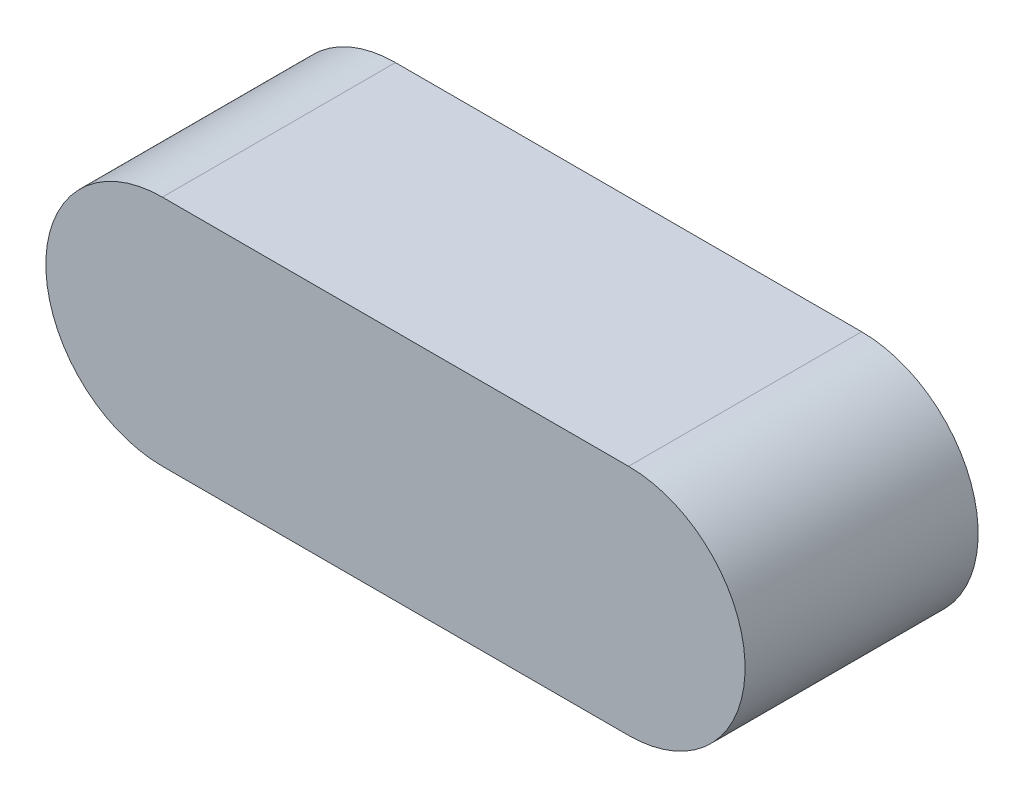
ISO-10303-21;
HEADER;
FILE_DESCRIPTION(('STEP AP214'),'2;1');
FILE_NAME('part.step','',(''),(''),'','','');
FILE_SCHEMA(('AUTOMOTIVE_DESIGN { 1 0 10303 214 1 1 1 1 }'));
ENDSEC;
DATA;
#1=APPLICATION_CONTEXT('core data for automotive mechanical design processes');
#2=APPLICATION_PROTOCOL_DEFINITION('international standard','automotive_design',2000,#1);
#3=PRODUCT_CONTEXT('',#1,'mechanical');
#4=PRODUCT('Part','Part','',(#3));
#5=PRODUCT_RELATED_PRODUCT_CATEGORY('part','',(#4));
#6=PRODUCT_DEFINITION_FORMATION('','',#4);
#7=PRODUCT_DEFINITION_CONTEXT('part definition',#1,'design');
#8=PRODUCT_DEFINITION('design','',#6,#7);
#9=PRODUCT_DEFINITION_SHAPE('','',#8);
#10=(LENGTH_UNIT() NAMED_UNIT(*) SI_UNIT(.MILLI.,.METRE.));
#11=(NAMED_UNIT(*) PLANE_ANGLE_UNIT() SI_UNIT($,.RADIAN.));
#12=(NAMED_UNIT(*) SI_UNIT($,.STERADIAN.) SOLID_ANGLE_UNIT());
#13=UNCERTAINTY_MEASURE_WITH_UNIT(LENGTH_MEASURE(1.E-05),#10,'distance_accuracy_value','');
#14=(GEOMETRIC_REPRESENTATION_CONTEXT(3) GLOBAL_UNCERTAINTY_ASSIGNED_CONTEXT((#13)) GLOBAL_UNIT_ASSIGNED_CONTEXT((#10,
#11,#12)) REPRESENTATION_CONTEXT('',''));
#15=CARTESIAN_POINT('',(0.,0.,0.));
#16=DIRECTION('',(0.,0.,1.));
#17=DIRECTION('',(1.,0.,0.));
#18=AXIS2_PLACEMENT_3D('',#15,#16,#17);
#19=CARTESIAN_POINT('',(5.,-10.,5.));
#20=DIRECTION('',(0.,0.,-1.));
#21=DIRECTION('',(-1.,0.,0.));
#22=AXIS2_PLACEMENT_3D('',#19,#20,#21);
#23=CYLINDRICAL_SURFACE('',#22,5.);
#24=CARTESIAN_POINT('',(5.,-10.,-5.));
#25=DIRECTION('',(0.,0.,1.));
#26=DIRECTION('',(1.,0.,0.));
#27=AXIS2_PLACEMENT_3D('',#24,#25,#26);
#28=CIRCLE('',#27,5.);
#29=CARTESIAN_POINT('',(5.,-4.99999999999999,-5.));
#30=VERTEX_POINT('',#29);
#31=CARTESIAN_POINT('',(5.,-15.,-5.));
#32=VERTEX_POINT('',#31);
#33=EDGE_CURVE('E104',#30,#32,#28,.T.);
#34=ORIENTED_EDGE('',*,*,#33,.T.);
#35=DIRECTION('',(0.,0.,-1.));
#36=VECTOR('',#35,1.);
#37=CARTESIAN_POINT('',(5.,-15.,5.));
#38=LINE('',#37,#36);
#39=CARTESIAN_POINT('',(5.,-15.,5.));
#40=VERTEX_POINT('',#39);
#41=EDGE_CURVE('E11',#40,#32,#38,.T.);
#42=ORIENTED_EDGE('',*,*,#41,.F.);
#43=CARTESIAN_POINT('',(5.,-10.,5.));
#44=DIRECTION('',(0.,0.,1.));
#45=DIRECTION('',(1.,0.,0.));
#46=AXIS2_PLACEMENT_3D('',#43,#44,#45);
#47=CIRCLE('',#46,5.);
#48=CARTESIAN_POINT('',(5.,-4.99999999999999,5.));
#49=VERTEX_POINT('',#48);
#50=EDGE_CURVE('E81',#49,#40,#47,.T.);
#51=ORIENTED_EDGE('',*,*,#50,.F.);
#52=DIRECTION('',(0.,0.,-1.));
#53=VECTOR('',#52,1.);
#54=CARTESIAN_POINT('',(5.,-4.99999999999999,5.));
#55=LINE('',#54,#53);
#56=EDGE_CURVE('E57',#49,#30,#55,.T.);
#57=ORIENTED_EDGE('',*,*,#56,.T.);
#58=EDGE_LOOP('',(#34,#42,#51,#57));
#59=FACE_BOUND('',#58,.T.);
#60=ADVANCED_FACE('F41',(#59),#23,.T.);
#61=CARTESIAN_POINT('',(25.,-15.,5.));
#62=DIRECTION('',(0.,-1.,0.));
#63=DIRECTION('',(0.,0.,-1.));
#64=AXIS2_PLACEMENT_3D('',#61,#62,#63);
#65=PLANE('',#64);
#66=DIRECTION('',(-1.,0.,0.));
#67=VECTOR('',#66,1.);
#68=CARTESIAN_POINT('',(25.,-15.,-5.));
#69=LINE('',#68,#67);
#70=CARTESIAN_POINT('',(25.,-15.,-5.));
#71=VERTEX_POINT('',#70);
#72=EDGE_CURVE('E90',#71,#32,#69,.T.);
#73=ORIENTED_EDGE('',*,*,#72,.F.);
#74=DIRECTION('',(0.,0.,-1.));
#75=VECTOR('',#74,1.);
#76=CARTESIAN_POINT('',(25.,-15.,5.));
#77=LINE('',#76,#75);
#78=CARTESIAN_POINT('',(25.,-15.,5.));
#79=VERTEX_POINT('',#78);
#80=EDGE_CURVE('E49',#79,#71,#77,.T.);
#81=ORIENTED_EDGE('',*,*,#80,.F.);
#82=DIRECTION('',(-1.,0.,0.));
#83=VECTOR('',#82,1.);
#84=CARTESIAN_POINT('',(25.,-15.,5.));
#85=LINE('',#84,#83);
#86=EDGE_CURVE('E88',#79,#40,#85,.T.);
#87=ORIENTED_EDGE('',*,*,#86,.T.);
#88=ORIENTED_EDGE('',*,*,#41,.T.);
#89=EDGE_LOOP('',(#73,#81,#87,#88));
#90=FACE_BOUND('',#89,.T.);
#91=ADVANCED_FACE('F87',(#90),#65,.T.);
#92=CARTESIAN_POINT('',(25.,-10.,5.));
#93=DIRECTION('',(0.,0.,-1.));
#94=DIRECTION('',(-1.,0.,0.));
#95=AXIS2_PLACEMENT_3D('',#92,#93,#94);
#96=CYLINDRICAL_SURFACE('',#95,5.);
#97=CARTESIAN_POINT('',(25.,-10.,-5.));
#98=DIRECTION('',(0.,0.,-1.));
#99=DIRECTION('',(-1.,0.,0.));
#100=AXIS2_PLACEMENT_3D('',#97,#98,#99);
#101=CIRCLE('',#100,5.);
#102=CARTESIAN_POINT('',(25.,-4.99999999999999,-5.));
#103=VERTEX_POINT('',#102);
#104=EDGE_CURVE('E107',#103,#71,#101,.T.);
#105=ORIENTED_EDGE('',*,*,#104,.F.);
#106=DIRECTION('',(0.,0.,-1.));
#107=VECTOR('',#106,1.);
#108=CARTESIAN_POINT('',(25.,-4.99999999999999,5.));
#109=LINE('',#108,#107);
#110=CARTESIAN_POINT('',(25.,-4.99999999999999,5.));
#111=VERTEX_POINT('',#110);
#112=EDGE_CURVE('E70',#111,#103,#109,.T.);
#113=ORIENTED_EDGE('',*,*,#112,.F.);
#114=CARTESIAN_POINT('',(25.,-10.,5.));
#115=DIRECTION('',(0.,0.,-1.));
#116=DIRECTION('',(-1.,0.,0.));
#117=AXIS2_PLACEMENT_3D('',#114,#115,#116);
#118=CIRCLE('',#117,5.);
#119=EDGE_CURVE('E96',#111,#79,#118,.T.);
#120=ORIENTED_EDGE('',*,*,#119,.T.);
#121=ORIENTED_EDGE('',*,*,#80,.T.);
#122=EDGE_LOOP('',(#105,#113,#120,#121));
#123=FACE_BOUND('',#122,.T.);
#124=ADVANCED_FACE('F98',(#123),#96,.T.);
#125=CARTESIAN_POINT('',(5.,-4.99999999999999,5.));
#126=DIRECTION('',(0.,1.,0.));
#127=DIRECTION('',(0.,0.,1.));
#128=AXIS2_PLACEMENT_3D('',#125,#126,#127);
#129=PLANE('',#128);
#130=DIRECTION('',(1.,0.,0.));
#131=VECTOR('',#130,1.);
#132=CARTESIAN_POINT('',(5.,-4.99999999999999,-5.));
#133=LINE('',#132,#131);
#134=EDGE_CURVE('E109',#30,#103,#133,.T.);
#135=ORIENTED_EDGE('',*,*,#134,.F.);
#136=ORIENTED_EDGE('',*,*,#56,.F.);
#137=DIRECTION('',(1.,0.,0.));
#138=VECTOR('',#137,1.);
#139=CARTESIAN_POINT('',(5.,-4.99999999999999,5.));
#140=LINE('',#139,#138);
#141=EDGE_CURVE('E99',#49,#111,#140,.T.);
#142=ORIENTED_EDGE('',*,*,#141,.T.);
#143=ORIENTED_EDGE('',*,*,#112,.T.);
#144=EDGE_LOOP('',(#135,#136,#142,#143));
#145=FACE_BOUND('',#144,.T.);
#146=ADVANCED_FACE('F115',(#145),#129,.T.);
#147=CARTESIAN_POINT('',(5.,-10.,5.));
#148=DIRECTION('',(0.,0.,1.));
#149=DIRECTION('',(1.,0.,0.));
#150=AXIS2_PLACEMENT_3D('',#147,#148,#149);
#151=PLANE('',#150);
#152=ORIENTED_EDGE('',*,*,#50,.T.);
#153=ORIENTED_EDGE('',*,*,#86,.F.);
#154=ORIENTED_EDGE('',*,*,#119,.F.);
#155=ORIENTED_EDGE('',*,*,#141,.F.);
#156=EDGE_LOOP('',(#152,#153,#154,#155));
#157=FACE_BOUND('',#156,.T.);
#158=ADVANCED_FACE('F95',(#157),#151,.T.);
#159=CARTESIAN_POINT('',(5.,-10.,-5.));
#160=DIRECTION('',(0.,0.,1.));
#161=DIRECTION('',(1.,0.,0.));
#162=AXIS2_PLACEMENT_3D('',#159,#160,#161);
#163=PLANE('',#162);
#164=ORIENTED_EDGE('',*,*,#33,.F.);
#165=ORIENTED_EDGE('',*,*,#134,.T.);
#166=ORIENTED_EDGE('',*,*,#104,.T.);
#167=ORIENTED_EDGE('',*,*,#72,.T.);
#168=EDGE_LOOP('',(#164,#165,#166,#167));
#169=FACE_BOUND('',#168,.T.);
#170=ADVANCED_FACE('F114',(#169),#163,.F.);
#171=CLOSED_SHELL('',(#60,#91,#124,#146,#158,#170));
#172=MANIFOLD_SOLID_BREP('B2',#171);
#173=ADVANCED_BREP_SHAPE_REPRESENTATION('',(#18,#172),#14);
#174=SHAPE_DEFINITION_REPRESENTATION(#9,#173);
ENDSEC;
END-ISO-10303-21;
